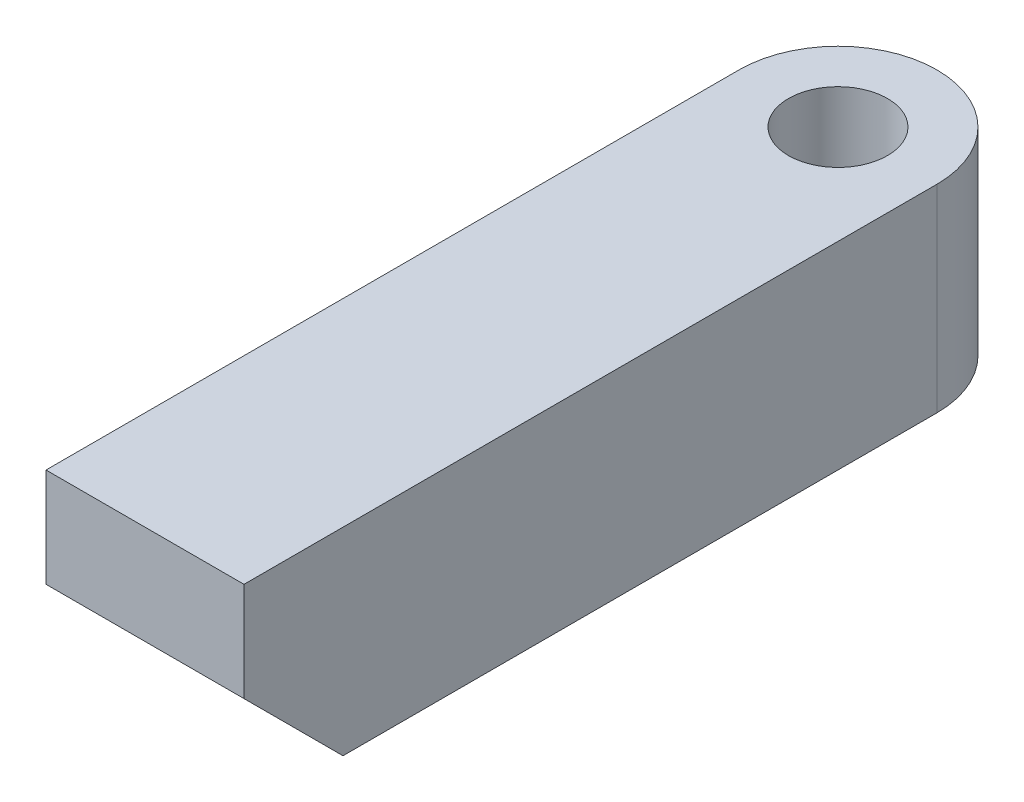
ISO-10303-21;
HEADER;
FILE_DESCRIPTION(('STEP AP214'),'2;1');
FILE_NAME('part.step','',(''),(''),'','','');
FILE_SCHEMA(('AUTOMOTIVE_DESIGN { 1 0 10303 214 1 1 1 1 }'));
ENDSEC;
DATA;
#1=APPLICATION_CONTEXT('core data for automotive mechanical design processes');
#2=APPLICATION_PROTOCOL_DEFINITION('international standard','automotive_design',2000,#1);
#3=PRODUCT_CONTEXT('',#1,'mechanical');
#4=PRODUCT('Part','Part','',(#3));
#5=PRODUCT_RELATED_PRODUCT_CATEGORY('part','',(#4));
#6=PRODUCT_DEFINITION_FORMATION('','',#4);
#7=PRODUCT_DEFINITION_CONTEXT('part definition',#1,'design');
#8=PRODUCT_DEFINITION('design','',#6,#7);
#9=PRODUCT_DEFINITION_SHAPE('','',#8);
#10=(LENGTH_UNIT() NAMED_UNIT(*) SI_UNIT(.MILLI.,.METRE.));
#11=(NAMED_UNIT(*) PLANE_ANGLE_UNIT() SI_UNIT($,.RADIAN.));
#12=(NAMED_UNIT(*) SI_UNIT($,.STERADIAN.) SOLID_ANGLE_UNIT());
#13=UNCERTAINTY_MEASURE_WITH_UNIT(LENGTH_MEASURE(1.E-05),#10,'distance_accuracy_value','');
#14=(GEOMETRIC_REPRESENTATION_CONTEXT(3) GLOBAL_UNCERTAINTY_ASSIGNED_CONTEXT((#13)) GLOBAL_UNIT_ASSIGNED_CONTEXT((#10,
#11,#12)) REPRESENTATION_CONTEXT('',''));
#15=CARTESIAN_POINT('',(0.,0.,0.));
#16=DIRECTION('',(0.,0.,1.));
#17=DIRECTION('',(1.,0.,0.));
#18=AXIS2_PLACEMENT_3D('',#15,#16,#17);
#19=CARTESIAN_POINT('',(5.,10.,20.));
#20=DIRECTION('',(-1.,0.,0.));
#21=DIRECTION('',(0.,0.,1.));
#22=AXIS2_PLACEMENT_3D('',#19,#20,#21);
#23=PLANE('',#22);
#24=DIRECTION('',(0.,-1.,0.));
#25=VECTOR('',#24,1.);
#26=CARTESIAN_POINT('',(5.,10.,20.));
#27=LINE('',#26,#25);
#28=CARTESIAN_POINT('',(5.,10.,20.));
#29=VERTEX_POINT('',#28);
#30=CARTESIAN_POINT('',(5.,4.99999999999999,20.));
#31=VERTEX_POINT('',#30);
#32=EDGE_CURVE('E117',#29,#31,#27,.T.);
#33=ORIENTED_EDGE('',*,*,#32,.T.);
#34=DIRECTION('',(0.,-0.707106781186546,-0.707106781186549));
#35=VECTOR('',#34,1.);
#36=CARTESIAN_POINT('',(5.,4.99999999999999,20.));
#37=LINE('',#36,#35);
#38=CARTESIAN_POINT('',(5.,0.,15.));
#39=VERTEX_POINT('',#38);
#40=EDGE_CURVE('E65',#31,#39,#37,.T.);
#41=ORIENTED_EDGE('',*,*,#40,.T.);
#42=DIRECTION('',(0.,0.,-1.));
#43=VECTOR('',#42,1.);
#44=CARTESIAN_POINT('',(5.,0.,20.));
#45=LINE('',#44,#43);
#46=CARTESIAN_POINT('',(5.,0.,-15.));
#47=VERTEX_POINT('',#46);
#48=EDGE_CURVE('E127',#39,#47,#45,.T.);
#49=ORIENTED_EDGE('',*,*,#48,.T.);
#50=DIRECTION('',(0.,-1.,0.));
#51=VECTOR('',#50,1.);
#52=CARTESIAN_POINT('',(5.,10.,-15.));
#53=LINE('',#52,#51);
#54=CARTESIAN_POINT('',(5.,10.,-15.));
#55=VERTEX_POINT('',#54);
#56=EDGE_CURVE('E140',#47,#55,#53,.F.);
#57=ORIENTED_EDGE('',*,*,#56,.T.);
#58=DIRECTION('',(0.,0.,-1.));
#59=VECTOR('',#58,1.);
#60=CARTESIAN_POINT('',(5.,10.,20.));
#61=LINE('',#60,#59);
#62=EDGE_CURVE('E106',#29,#55,#61,.T.);
#63=ORIENTED_EDGE('',*,*,#62,.F.);
#64=EDGE_LOOP('',(#33,#41,#49,#57,#63));
#65=FACE_BOUND('',#64,.T.);
#66=ADVANCED_FACE('F41',(#65),#23,.F.);
#67=CARTESIAN_POINT('',(-5.,10.,20.));
#68=DIRECTION('',(1.,0.,0.));
#69=DIRECTION('',(0.,0.,-1.));
#70=AXIS2_PLACEMENT_3D('',#67,#68,#69);
#71=PLANE('',#70);
#72=DIRECTION('',(0.,0.,1.));
#73=VECTOR('',#72,1.);
#74=CARTESIAN_POINT('',(-5.,0.,20.));
#75=LINE('',#74,#73);
#76=CARTESIAN_POINT('',(-5.,0.,-15.));
#77=VERTEX_POINT('',#76);
#78=CARTESIAN_POINT('',(-5.,0.,15.));
#79=VERTEX_POINT('',#78);
#80=EDGE_CURVE('E130',#77,#79,#75,.T.);
#81=ORIENTED_EDGE('',*,*,#80,.T.);
#82=DIRECTION('',(0.,0.707106781186546,0.707106781186549));
#83=VECTOR('',#82,1.);
#84=CARTESIAN_POINT('',(-5.,4.99999999999999,20.));
#85=LINE('',#84,#83);
#86=CARTESIAN_POINT('',(-5.,4.99999999999999,20.));
#87=VERTEX_POINT('',#86);
#88=EDGE_CURVE('E11',#79,#87,#85,.T.);
#89=ORIENTED_EDGE('',*,*,#88,.T.);
#90=DIRECTION('',(0.,-1.,0.));
#91=VECTOR('',#90,1.);
#92=CARTESIAN_POINT('',(-5.,10.,20.));
#93=LINE('',#92,#91);
#94=CARTESIAN_POINT('',(-5.,10.,20.));
#95=VERTEX_POINT('',#94);
#96=EDGE_CURVE('E109',#95,#87,#93,.T.);
#97=ORIENTED_EDGE('',*,*,#96,.F.);
#98=DIRECTION('',(0.,0.,1.));
#99=VECTOR('',#98,1.);
#100=CARTESIAN_POINT('',(-5.,10.,20.));
#101=LINE('',#100,#99);
#102=CARTESIAN_POINT('',(-5.,10.,-15.));
#103=VERTEX_POINT('',#102);
#104=EDGE_CURVE('E94',#103,#95,#101,.T.);
#105=ORIENTED_EDGE('',*,*,#104,.F.);
#106=DIRECTION('',(0.,-1.,0.));
#107=VECTOR('',#106,1.);
#108=CARTESIAN_POINT('',(-5.,10.,-15.));
#109=LINE('',#108,#107);
#110=EDGE_CURVE('E149',#103,#77,#109,.T.);
#111=ORIENTED_EDGE('',*,*,#110,.T.);
#112=EDGE_LOOP('',(#81,#89,#97,#105,#111));
#113=FACE_BOUND('',#112,.T.);
#114=ADVANCED_FACE('F110',(#113),#71,.F.);
#115=CARTESIAN_POINT('',(-5.,10.,20.));
#116=DIRECTION('',(0.,0.,-1.));
#117=DIRECTION('',(-1.,0.,0.));
#118=AXIS2_PLACEMENT_3D('',#115,#116,#117);
#119=PLANE('',#118);
#120=ORIENTED_EDGE('',*,*,#96,.T.);
#121=DIRECTION('',(1.,0.,0.));
#122=VECTOR('',#121,1.);
#123=CARTESIAN_POINT('',(5.,4.99999999999999,20.));
#124=LINE('',#123,#122);
#125=EDGE_CURVE('E152',#87,#31,#124,.T.);
#126=ORIENTED_EDGE('',*,*,#125,.T.);
#127=ORIENTED_EDGE('',*,*,#32,.F.);
#128=DIRECTION('',(1.,0.,0.));
#129=VECTOR('',#128,1.);
#130=CARTESIAN_POINT('',(-5.,10.,20.));
#131=LINE('',#130,#129);
#132=EDGE_CURVE('E99',#95,#29,#131,.T.);
#133=ORIENTED_EDGE('',*,*,#132,.F.);
#134=EDGE_LOOP('',(#120,#126,#127,#133));
#135=FACE_BOUND('',#134,.T.);
#136=ADVANCED_FACE('F119',(#135),#119,.F.);
#137=CARTESIAN_POINT('',(0.,10.,0.));
#138=DIRECTION('',(0.,-1.,0.));
#139=DIRECTION('',(0.,0.,-1.));
#140=AXIS2_PLACEMENT_3D('',#137,#138,#139);
#141=PLANE('',#140);
#142=CARTESIAN_POINT('',(0.,10.,-15.));
#143=DIRECTION('',(0.,1.,0.));
#144=DIRECTION('',(0.,0.,1.));
#145=AXIS2_PLACEMENT_3D('',#142,#143,#144);
#146=CIRCLE('',#145,2.5);
#147=CARTESIAN_POINT('',(0.,10.,-12.5));
#148=VERTEX_POINT('',#147);
#149=EDGE_CURVE('E157',#148,#148,#146,.T.);
#150=ORIENTED_EDGE('',*,*,#149,.F.);
#151=EDGE_LOOP('',(#150));
#152=FACE_BOUND('',#151,.T.);
#153=ORIENTED_EDGE('',*,*,#62,.T.);
#154=CARTESIAN_POINT('',(0.,10.,-15.));
#155=DIRECTION('',(0.,-1.,0.));
#156=DIRECTION('',(0.,0.,-1.));
#157=AXIS2_PLACEMENT_3D('',#154,#155,#156);
#158=CIRCLE('',#157,5.);
#159=CARTESIAN_POINT('',(0.,10.,-20.));
#160=VERTEX_POINT('',#159);
#161=EDGE_CURVE('E146',#55,#160,#158,.F.);
#162=ORIENTED_EDGE('',*,*,#161,.T.);
#163=CARTESIAN_POINT('',(0.,10.,-15.));
#164=DIRECTION('',(0.,-1.,0.));
#165=DIRECTION('',(0.,0.,-1.));
#166=AXIS2_PLACEMENT_3D('',#163,#164,#165);
#167=CIRCLE('',#166,5.);
#168=EDGE_CURVE('E102',#160,#103,#167,.F.);
#169=ORIENTED_EDGE('',*,*,#168,.T.);
#170=ORIENTED_EDGE('',*,*,#104,.T.);
#171=ORIENTED_EDGE('',*,*,#132,.T.);
#172=EDGE_LOOP('',(#153,#162,#169,#170,#171));
#173=FACE_BOUND('',#172,.T.);
#174=ADVANCED_FACE('F97',(#152,#173),#141,.F.);
#175=CARTESIAN_POINT('',(0.,0.,0.));
#176=DIRECTION('',(0.,-1.,0.));
#177=DIRECTION('',(0.,0.,-1.));
#178=AXIS2_PLACEMENT_3D('',#175,#176,#177);
#179=PLANE('',#178);
#180=CARTESIAN_POINT('',(0.,0.,-15.));
#181=DIRECTION('',(0.,-1.,0.));
#182=DIRECTION('',(0.,0.,-1.));
#183=AXIS2_PLACEMENT_3D('',#180,#181,#182);
#184=CIRCLE('',#183,2.5);
#185=CARTESIAN_POINT('',(0.,0.,-17.5));
#186=VERTEX_POINT('',#185);
#187=EDGE_CURVE('E131',#186,#186,#184,.T.);
#188=ORIENTED_EDGE('',*,*,#187,.F.);
#189=EDGE_LOOP('',(#188));
#190=FACE_BOUND('',#189,.T.);
#191=ORIENTED_EDGE('',*,*,#48,.F.);
#192=DIRECTION('',(-1.,0.,0.));
#193=VECTOR('',#192,1.);
#194=CARTESIAN_POINT('',(-5.,0.,15.));
#195=LINE('',#194,#193);
#196=EDGE_CURVE('E51',#39,#79,#195,.T.);
#197=ORIENTED_EDGE('',*,*,#196,.T.);
#198=ORIENTED_EDGE('',*,*,#80,.F.);
#199=CARTESIAN_POINT('',(0.,0.,-15.));
#200=DIRECTION('',(0.,-1.,0.));
#201=DIRECTION('',(0.,0.,-1.));
#202=AXIS2_PLACEMENT_3D('',#199,#200,#201);
#203=CIRCLE('',#202,5.);
#204=CARTESIAN_POINT('',(0.,0.,-20.));
#205=VERTEX_POINT('',#204);
#206=EDGE_CURVE('E116',#77,#205,#203,.T.);
#207=ORIENTED_EDGE('',*,*,#206,.T.);
#208=CARTESIAN_POINT('',(0.,0.,-15.));
#209=DIRECTION('',(0.,-1.,0.));
#210=DIRECTION('',(0.,0.,-1.));
#211=AXIS2_PLACEMENT_3D('',#208,#209,#210);
#212=CIRCLE('',#211,5.);
#213=EDGE_CURVE('E136',#205,#47,#212,.T.);
#214=ORIENTED_EDGE('',*,*,#213,.T.);
#215=EDGE_LOOP('',(#191,#197,#198,#207,#214));
#216=FACE_BOUND('',#215,.T.);
#217=ADVANCED_FACE('F177',(#190,#216),#179,.T.);
#218=CARTESIAN_POINT('',(0.,10.,-15.));
#219=DIRECTION('',(0.,1.,0.));
#220=DIRECTION('',(0.,0.,1.));
#221=AXIS2_PLACEMENT_3D('',#218,#219,#220);
#222=CYLINDRICAL_SURFACE('',#221,2.5);
#223=ORIENTED_EDGE('',*,*,#149,.T.);
#224=EDGE_LOOP('',(#223));
#225=FACE_BOUND('',#224,.T.);
#226=ORIENTED_EDGE('',*,*,#187,.T.);
#227=EDGE_LOOP('',(#226));
#228=FACE_BOUND('',#227,.T.);
#229=ADVANCED_FACE('F173',(#225,#228),#222,.F.);
#230=CARTESIAN_POINT('',(0.,10.,-15.));
#231=DIRECTION('',(0.,-1.,0.));
#232=DIRECTION('',(0.,0.,-1.));
#233=AXIS2_PLACEMENT_3D('',#230,#231,#232);
#234=CYLINDRICAL_SURFACE('',#233,5.);
#235=ORIENTED_EDGE('',*,*,#110,.F.);
#236=ORIENTED_EDGE('',*,*,#168,.F.);
#237=DIRECTION('',(0.,-1.,0.));
#238=VECTOR('',#237,1.);
#239=CARTESIAN_POINT('',(0.,10.,-20.));
#240=LINE('',#239,#238);
#241=EDGE_CURVE('E153',#205,#160,#240,.F.);
#242=ORIENTED_EDGE('',*,*,#241,.F.);
#243=ORIENTED_EDGE('',*,*,#206,.F.);
#244=EDGE_LOOP('',(#235,#236,#242,#243));
#245=FACE_BOUND('',#244,.T.);
#246=ADVANCED_FACE('F196',(#245),#234,.T.);
#247=CARTESIAN_POINT('',(0.,10.,-15.));
#248=DIRECTION('',(0.,-1.,0.));
#249=DIRECTION('',(0.,0.,-1.));
#250=AXIS2_PLACEMENT_3D('',#247,#248,#249);
#251=CYLINDRICAL_SURFACE('',#250,5.);
#252=ORIENTED_EDGE('',*,*,#161,.F.);
#253=ORIENTED_EDGE('',*,*,#56,.F.);
#254=ORIENTED_EDGE('',*,*,#213,.F.);
#255=ORIENTED_EDGE('',*,*,#241,.T.);
#256=EDGE_LOOP('',(#252,#253,#254,#255));
#257=FACE_BOUND('',#256,.T.);
#258=ADVANCED_FACE('F194',(#257),#251,.T.);
#259=CARTESIAN_POINT('',(-5.,4.99999999999999,20.));
#260=DIRECTION('',(0.,-0.707106781186549,0.707106781186546));
#261=DIRECTION('',(-1.,0.,0.));
#262=AXIS2_PLACEMENT_3D('',#259,#260,#261);
#263=PLANE('',#262);
#264=ORIENTED_EDGE('',*,*,#88,.F.);
#265=ORIENTED_EDGE('',*,*,#196,.F.);
#266=ORIENTED_EDGE('',*,*,#40,.F.);
#267=ORIENTED_EDGE('',*,*,#125,.F.);
#268=EDGE_LOOP('',(#264,#265,#266,#267));
#269=FACE_BOUND('',#268,.T.);
#270=ADVANCED_FACE('F44',(#269),#263,.T.);
#271=CLOSED_SHELL('',(#66,#114,#136,#174,#217,#229,#246,#258,#270));
#272=MANIFOLD_SOLID_BREP('B2',#271);
#273=ADVANCED_BREP_SHAPE_REPRESENTATION('',(#18,#272),#14);
#274=SHAPE_DEFINITION_REPRESENTATION(#9,#273);
ENDSEC;
END-ISO-10303-21;
